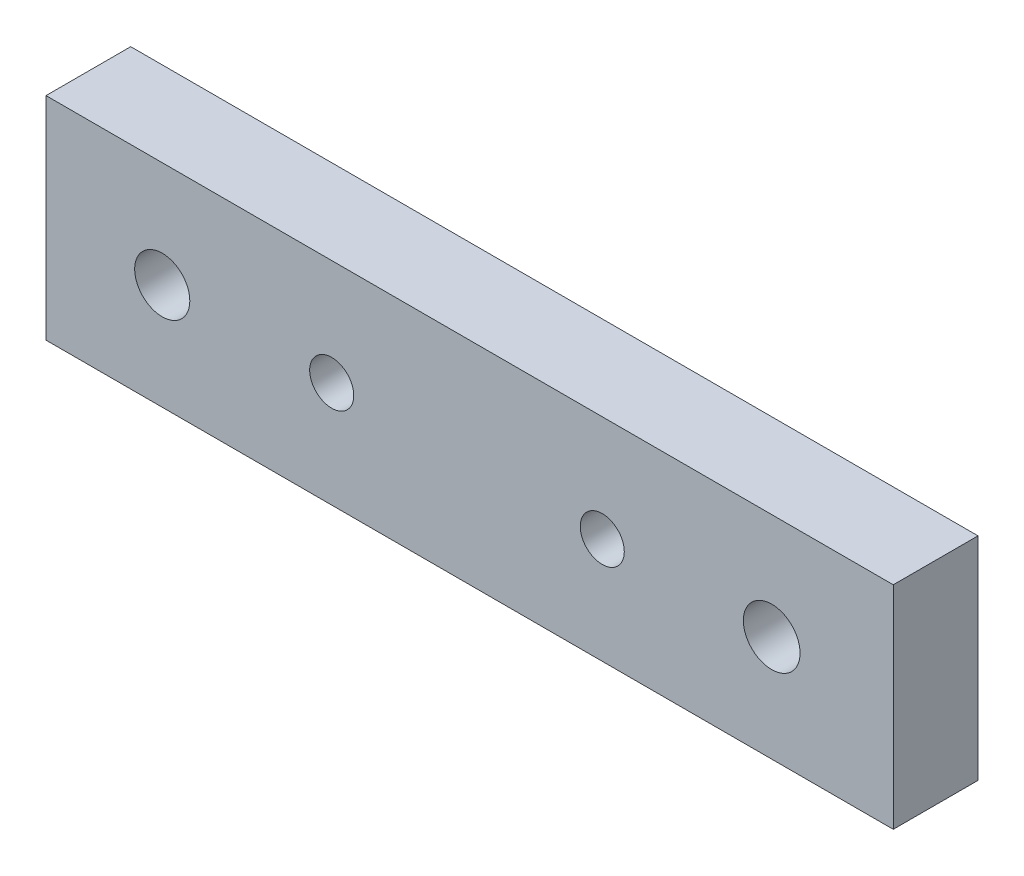
ISO-10303-21;
HEADER;
FILE_DESCRIPTION(('STEP AP214'),'2;1');
FILE_NAME('part.step','',(''),(''),'','','');
FILE_SCHEMA(('AUTOMOTIVE_DESIGN { 1 0 10303 214 1 1 1 1 }'));
ENDSEC;
DATA;
#1=APPLICATION_CONTEXT('core data for automotive mechanical design processes');
#2=APPLICATION_PROTOCOL_DEFINITION('international standard','automotive_design',2000,#1);
#3=PRODUCT_CONTEXT('',#1,'mechanical');
#4=PRODUCT('Part','Part','',(#3));
#5=PRODUCT_RELATED_PRODUCT_CATEGORY('part','',(#4));
#6=PRODUCT_DEFINITION_FORMATION('','',#4);
#7=PRODUCT_DEFINITION_CONTEXT('part definition',#1,'design');
#8=PRODUCT_DEFINITION('design','',#6,#7);
#9=PRODUCT_DEFINITION_SHAPE('','',#8);
#10=(LENGTH_UNIT() NAMED_UNIT(*) SI_UNIT(.MILLI.,.METRE.));
#11=(NAMED_UNIT(*) PLANE_ANGLE_UNIT() SI_UNIT($,.RADIAN.));
#12=(NAMED_UNIT(*) SI_UNIT($,.STERADIAN.) SOLID_ANGLE_UNIT());
#13=UNCERTAINTY_MEASURE_WITH_UNIT(LENGTH_MEASURE(1.E-05),#10,'distance_accuracy_value','');
#14=(GEOMETRIC_REPRESENTATION_CONTEXT(3) GLOBAL_UNCERTAINTY_ASSIGNED_CONTEXT((#13)) GLOBAL_UNIT_ASSIGNED_CONTEXT((#10,
#11,#12)) REPRESENTATION_CONTEXT('',''));
#15=CARTESIAN_POINT('',(0.,0.,0.));
#16=DIRECTION('',(0.,0.,1.));
#17=DIRECTION('',(1.,0.,0.));
#18=AXIS2_PLACEMENT_3D('',#15,#16,#17);
#19=CARTESIAN_POINT('',(-85.3473640143417,12.5,-75.));
#20=DIRECTION('',(0.,0.,1.));
#21=DIRECTION('',(1.,0.,0.));
#22=AXIS2_PLACEMENT_3D('',#19,#20,#21);
#23=CYLINDRICAL_SURFACE('',#22,3.34609875630122);
#24=CARTESIAN_POINT('',(-85.3473640143417,12.5,-17.5));
#25=DIRECTION('',(0.,0.,1.));
#26=DIRECTION('',(1.,0.,0.));
#27=AXIS2_PLACEMENT_3D('',#24,#25,#26);
#28=CIRCLE('',#27,3.34609875630122);
#29=CARTESIAN_POINT('',(-82.0012652580405,12.5,-17.5));
#30=VERTEX_POINT('',#29);
#31=EDGE_CURVE('E444',#30,#30,#28,.T.);
#32=ORIENTED_EDGE('',*,*,#31,.T.);
#33=EDGE_LOOP('',(#32));
#34=FACE_BOUND('',#33,.T.);
#35=CARTESIAN_POINT('',(-85.3473640143417,12.5,-24.5));
#36=DIRECTION('',(0.,0.,-1.));
#37=DIRECTION('',(-1.,0.,0.));
#38=AXIS2_PLACEMENT_3D('',#35,#36,#37);
#39=CIRCLE('',#38,3.34609875630122);
#40=CARTESIAN_POINT('',(-88.6934627706429,12.5,-24.5));
#41=VERTEX_POINT('',#40);
#42=EDGE_CURVE('E36',#41,#41,#39,.F.);
#43=ORIENTED_EDGE('',*,*,#42,.F.);
#44=EDGE_LOOP('',(#43));
#45=FACE_BOUND('',#44,.T.);
#46=ADVANCED_FACE('F32',(#34,#45),#23,.F.);
#47=CARTESIAN_POINT('',(-157.28059455583,12.5,-75.));
#48=DIRECTION('',(0.,0.,1.));
#49=DIRECTION('',(1.,0.,0.));
#50=AXIS2_PLACEMENT_3D('',#47,#48,#49);
#51=CYLINDRICAL_SURFACE('',#50,3.25257439357136);
#52=CARTESIAN_POINT('',(-157.28059455583,12.5,-17.5));
#53=DIRECTION('',(0.,0.,1.));
#54=DIRECTION('',(1.,0.,0.));
#55=AXIS2_PLACEMENT_3D('',#52,#53,#54);
#56=CIRCLE('',#55,3.25257439357136);
#57=CARTESIAN_POINT('',(-154.028020162259,12.5,-17.5));
#58=VERTEX_POINT('',#57);
#59=EDGE_CURVE('E447',#58,#58,#56,.T.);
#60=ORIENTED_EDGE('',*,*,#59,.T.);
#61=EDGE_LOOP('',(#60));
#62=FACE_BOUND('',#61,.T.);
#63=CARTESIAN_POINT('',(-157.28059455583,12.5,-24.5));
#64=DIRECTION('',(0.,0.,-1.));
#65=DIRECTION('',(-1.,0.,0.));
#66=AXIS2_PLACEMENT_3D('',#63,#64,#65);
#67=CIRCLE('',#66,3.25257439357136);
#68=CARTESIAN_POINT('',(-160.533168949402,12.5,-24.5));
#69=VERTEX_POINT('',#68);
#70=EDGE_CURVE('E459',#69,#69,#67,.F.);
#71=ORIENTED_EDGE('',*,*,#70,.F.);
#72=EDGE_LOOP('',(#71));
#73=FACE_BOUND('',#72,.T.);
#74=ADVANCED_FACE('F469',(#62,#73),#51,.F.);
#75=CARTESIAN_POINT('',(-105.347364014342,12.5,-75.));
#76=DIRECTION('',(0.,0.,1.));
#77=DIRECTION('',(1.,0.,0.));
#78=AXIS2_PLACEMENT_3D('',#75,#76,#77);
#79=CYLINDRICAL_SURFACE('',#78,2.6);
#80=CARTESIAN_POINT('',(-105.347364014342,12.5,-17.5));
#81=DIRECTION('',(0.,0.,1.));
#82=DIRECTION('',(1.,0.,0.));
#83=AXIS2_PLACEMENT_3D('',#80,#81,#82);
#84=CIRCLE('',#83,2.6);
#85=CARTESIAN_POINT('',(-102.747364014342,12.5,-17.5));
#86=VERTEX_POINT('',#85);
#87=EDGE_CURVE('E450',#86,#86,#84,.T.);
#88=ORIENTED_EDGE('',*,*,#87,.T.);
#89=EDGE_LOOP('',(#88));
#90=FACE_BOUND('',#89,.T.);
#91=CARTESIAN_POINT('',(-105.347364014342,12.5,-24.5));
#92=DIRECTION('',(0.,0.,-1.));
#93=DIRECTION('',(-1.,0.,0.));
#94=AXIS2_PLACEMENT_3D('',#91,#92,#93);
#95=CIRCLE('',#94,2.6);
#96=CARTESIAN_POINT('',(-107.947364014342,12.5,-24.5));
#97=VERTEX_POINT('',#96);
#98=EDGE_CURVE('E457',#97,#97,#95,.F.);
#99=ORIENTED_EDGE('',*,*,#98,.F.);
#100=EDGE_LOOP('',(#99));
#101=FACE_BOUND('',#100,.T.);
#102=ADVANCED_FACE('F475',(#90,#101),#79,.F.);
#103=CARTESIAN_POINT('',(-137.28059455583,12.5,-75.));
#104=DIRECTION('',(0.,0.,1.));
#105=DIRECTION('',(1.,0.,0.));
#106=AXIS2_PLACEMENT_3D('',#103,#104,#105);
#107=CYLINDRICAL_SURFACE('',#106,2.59999999999999);
#108=CARTESIAN_POINT('',(-137.28059455583,12.5,-17.5));
#109=DIRECTION('',(0.,0.,1.));
#110=DIRECTION('',(1.,0.,0.));
#111=AXIS2_PLACEMENT_3D('',#108,#109,#110);
#112=CIRCLE('',#111,2.59999999999999);
#113=CARTESIAN_POINT('',(-134.68059455583,12.5,-17.5));
#114=VERTEX_POINT('',#113);
#115=EDGE_CURVE('E432',#114,#114,#112,.T.);
#116=ORIENTED_EDGE('',*,*,#115,.T.);
#117=EDGE_LOOP('',(#116));
#118=FACE_BOUND('',#117,.T.);
#119=CARTESIAN_POINT('',(-137.28059455583,12.5,-24.5));
#120=DIRECTION('',(0.,0.,-1.));
#121=DIRECTION('',(-1.,0.,0.));
#122=AXIS2_PLACEMENT_3D('',#119,#120,#121);
#123=CIRCLE('',#122,2.59999999999999);
#124=CARTESIAN_POINT('',(-139.88059455583,12.5,-24.5));
#125=VERTEX_POINT('',#124);
#126=EDGE_CURVE('E268',#125,#125,#123,.F.);
#127=ORIENTED_EDGE('',*,*,#126,.F.);
#128=EDGE_LOOP('',(#127));
#129=FACE_BOUND('',#128,.T.);
#130=ADVANCED_FACE('F501',(#118,#129),#107,.F.);
#131=CARTESIAN_POINT('',(-171.,0.,-27.5));
#132=DIRECTION('',(1.,0.,0.));
#133=DIRECTION('',(0.,0.,-1.));
#134=AXIS2_PLACEMENT_3D('',#131,#132,#133);
#135=PLANE('',#134);
#136=DIRECTION('',(0.,1.,0.));
#137=VECTOR('',#136,1.);
#138=CARTESIAN_POINT('',(-171.,0.,-17.5));
#139=LINE('',#138,#137);
#140=CARTESIAN_POINT('',(-171.,0.,-17.5));
#141=VERTEX_POINT('',#140);
#142=CARTESIAN_POINT('',(-171.,25.,-17.5));
#143=VERTEX_POINT('',#142);
#144=EDGE_CURVE('E428',#141,#143,#139,.T.);
#145=ORIENTED_EDGE('',*,*,#144,.T.);
#146=DIRECTION('',(0.,0.,1.));
#147=VECTOR('',#146,1.);
#148=CARTESIAN_POINT('',(-171.,25.,-27.5));
#149=LINE('',#148,#147);
#150=CARTESIAN_POINT('',(-171.,25.,-27.5));
#151=VERTEX_POINT('',#150);
#152=EDGE_CURVE('E11',#151,#143,#149,.T.);
#153=ORIENTED_EDGE('',*,*,#152,.F.);
#154=DIRECTION('',(0.,1.,0.));
#155=VECTOR('',#154,1.);
#156=CARTESIAN_POINT('',(-171.,0.,-27.5));
#157=LINE('',#156,#155);
#158=CARTESIAN_POINT('',(-171.,0.,-27.5));
#159=VERTEX_POINT('',#158);
#160=EDGE_CURVE('E417',#159,#151,#157,.T.);
#161=ORIENTED_EDGE('',*,*,#160,.F.);
#162=DIRECTION('',(0.,0.,1.));
#163=VECTOR('',#162,1.);
#164=CARTESIAN_POINT('',(-171.,0.,-27.5));
#165=LINE('',#164,#163);
#166=EDGE_CURVE('E427',#159,#141,#165,.T.);
#167=ORIENTED_EDGE('',*,*,#166,.T.);
#168=EDGE_LOOP('',(#145,#153,#161,#167));
#169=FACE_BOUND('',#168,.T.);
#170=ADVANCED_FACE('F34',(#169),#135,.F.);
#171=CARTESIAN_POINT('',(-71.,25.,-27.5));
#172=DIRECTION('',(0.,-1.,0.));
#173=DIRECTION('',(0.,0.,-1.));
#174=AXIS2_PLACEMENT_3D('',#171,#172,#173);
#175=PLANE('',#174);
#176=DIRECTION('',(1.,0.,0.));
#177=VECTOR('',#176,1.);
#178=CARTESIAN_POINT('',(-71.,25.,-17.5));
#179=LINE('',#178,#177);
#180=CARTESIAN_POINT('',(-71.,25.,-17.5));
#181=VERTEX_POINT('',#180);
#182=EDGE_CURVE('E431',#143,#181,#179,.T.);
#183=ORIENTED_EDGE('',*,*,#182,.T.);
#184=DIRECTION('',(0.,0.,1.));
#185=VECTOR('',#184,1.);
#186=CARTESIAN_POINT('',(-71.,25.,-27.5));
#187=LINE('',#186,#185);
#188=CARTESIAN_POINT('',(-71.,25.,-27.5));
#189=VERTEX_POINT('',#188);
#190=EDGE_CURVE('E41',#189,#181,#187,.T.);
#191=ORIENTED_EDGE('',*,*,#190,.F.);
#192=DIRECTION('',(1.,0.,0.));
#193=VECTOR('',#192,1.);
#194=CARTESIAN_POINT('',(-71.,25.,-27.5));
#195=LINE('',#194,#193);
#196=EDGE_CURVE('E420',#151,#189,#195,.T.);
#197=ORIENTED_EDGE('',*,*,#196,.F.);
#198=ORIENTED_EDGE('',*,*,#152,.T.);
#199=EDGE_LOOP('',(#183,#191,#197,#198));
#200=FACE_BOUND('',#199,.T.);
#201=ADVANCED_FACE('F494',(#200),#175,.F.);
#202=CARTESIAN_POINT('',(-71.,0.,-27.5));
#203=DIRECTION('',(-1.,0.,0.));
#204=DIRECTION('',(0.,0.,1.));
#205=AXIS2_PLACEMENT_3D('',#202,#203,#204);
#206=PLANE('',#205);
#207=DIRECTION('',(0.,-1.,0.));
#208=VECTOR('',#207,1.);
#209=CARTESIAN_POINT('',(-71.,0.,-17.5));
#210=LINE('',#209,#208);
#211=CARTESIAN_POINT('',(-71.,0.,-17.5));
#212=VERTEX_POINT('',#211);
#213=EDGE_CURVE('E434',#181,#212,#210,.T.);
#214=ORIENTED_EDGE('',*,*,#213,.T.);
#215=DIRECTION('',(0.,0.,1.));
#216=VECTOR('',#215,1.);
#217=CARTESIAN_POINT('',(-71.,0.,-27.5));
#218=LINE('',#217,#216);
#219=CARTESIAN_POINT('',(-71.,0.,-27.5));
#220=VERTEX_POINT('',#219);
#221=EDGE_CURVE('E439',#220,#212,#218,.T.);
#222=ORIENTED_EDGE('',*,*,#221,.F.);
#223=DIRECTION('',(0.,-1.,0.));
#224=VECTOR('',#223,1.);
#225=CARTESIAN_POINT('',(-71.,0.,-27.5));
#226=LINE('',#225,#224);
#227=EDGE_CURVE('E423',#189,#220,#226,.T.);
#228=ORIENTED_EDGE('',*,*,#227,.F.);
#229=ORIENTED_EDGE('',*,*,#190,.T.);
#230=EDGE_LOOP('',(#214,#222,#228,#229));
#231=FACE_BOUND('',#230,.T.);
#232=ADVANCED_FACE('F491',(#231),#206,.F.);
#233=CARTESIAN_POINT('',(-71.,0.,-27.5));
#234=DIRECTION('',(0.,1.,0.));
#235=DIRECTION('',(-1.,0.,0.));
#236=AXIS2_PLACEMENT_3D('',#233,#234,#235);
#237=PLANE('',#236);
#238=DIRECTION('',(-1.,0.,0.));
#239=VECTOR('',#238,1.);
#240=CARTESIAN_POINT('',(-71.,0.,-17.5));
#241=LINE('',#240,#239);
#242=EDGE_CURVE('E421',#212,#141,#241,.T.);
#243=ORIENTED_EDGE('',*,*,#242,.T.);
#244=ORIENTED_EDGE('',*,*,#166,.F.);
#245=DIRECTION('',(-1.,0.,0.));
#246=VECTOR('',#245,1.);
#247=CARTESIAN_POINT('',(-71.,0.,-27.5));
#248=LINE('',#247,#246);
#249=EDGE_CURVE('E425',#220,#159,#248,.T.);
#250=ORIENTED_EDGE('',*,*,#249,.F.);
#251=ORIENTED_EDGE('',*,*,#221,.T.);
#252=EDGE_LOOP('',(#243,#244,#250,#251));
#253=FACE_BOUND('',#252,.T.);
#254=ADVANCED_FACE('F484',(#253),#237,.F.);
#255=CARTESIAN_POINT('',(0.,0.,-27.5));
#256=DIRECTION('',(0.,0.,1.));
#257=DIRECTION('',(1.,0.,0.));
#258=AXIS2_PLACEMENT_3D('',#255,#256,#257);
#259=PLANE('',#258);
#260=DIRECTION('',(-0.499999999999999,0.866025403784439,0.));
#261=VECTOR('',#260,1.);
#262=CARTESIAN_POINT('',(-139.647730659508,8.4,-27.5));
#263=LINE('',#262,#261);
#264=CARTESIAN_POINT('',(-139.647730659508,8.39999999999999,-27.5));
#265=VERTEX_POINT('',#264);
#266=CARTESIAN_POINT('',(-142.014866763185,12.5,-27.5));
#267=VERTEX_POINT('',#266);
#268=EDGE_CURVE('E255',#265,#267,#263,.T.);
#269=ORIENTED_EDGE('',*,*,#268,.F.);
#270=DIRECTION('',(-1.,0.,0.));
#271=VECTOR('',#270,1.);
#272=CARTESIAN_POINT('',(-134.913458452153,8.4,-27.5));
#273=LINE('',#272,#271);
#274=CARTESIAN_POINT('',(-134.913458452153,8.4,-27.5));
#275=VERTEX_POINT('',#274);
#276=EDGE_CURVE('E49',#275,#265,#273,.T.);
#277=ORIENTED_EDGE('',*,*,#276,.F.);
#278=DIRECTION('',(-0.5,-0.866025403784438,0.));
#279=VECTOR('',#278,1.);
#280=CARTESIAN_POINT('',(-132.546322348475,12.5,-27.5));
#281=LINE('',#280,#279);
#282=CARTESIAN_POINT('',(-132.546322348475,12.5,-27.5));
#283=VERTEX_POINT('',#282);
#284=EDGE_CURVE('E241',#283,#275,#281,.T.);
#285=ORIENTED_EDGE('',*,*,#284,.F.);
#286=DIRECTION('',(0.499999999999994,-0.866025403784442,0.));
#287=VECTOR('',#286,1.);
#288=CARTESIAN_POINT('',(-134.913458452153,16.6,-27.5));
#289=LINE('',#288,#287);
#290=CARTESIAN_POINT('',(-134.913458452153,16.6,-27.5));
#291=VERTEX_POINT('',#290);
#292=EDGE_CURVE('E244',#291,#283,#289,.T.);
#293=ORIENTED_EDGE('',*,*,#292,.F.);
#294=DIRECTION('',(1.,0.,0.));
#295=VECTOR('',#294,1.);
#296=CARTESIAN_POINT('',(-139.647730659508,16.6,-27.5));
#297=LINE('',#296,#295);
#298=CARTESIAN_POINT('',(-139.647730659508,16.6,-27.5));
#299=VERTEX_POINT('',#298);
#300=EDGE_CURVE('E261',#299,#291,#297,.T.);
#301=ORIENTED_EDGE('',*,*,#300,.F.);
#302=DIRECTION('',(0.5,0.866025403784439,0.));
#303=VECTOR('',#302,1.);
#304=CARTESIAN_POINT('',(-142.014866763185,12.5,-27.5));
#305=LINE('',#304,#303);
#306=EDGE_CURVE('E258',#267,#299,#305,.T.);
#307=ORIENTED_EDGE('',*,*,#306,.F.);
#308=EDGE_LOOP('',(#269,#277,#285,#293,#301,#307));
#309=FACE_BOUND('',#308,.T.);
#310=DIRECTION('',(-0.499999999999999,0.866025403784439,0.));
#311=VECTOR('',#310,1.);
#312=CARTESIAN_POINT('',(-107.714500118019,8.40000000000002,-27.5));
#313=LINE('',#312,#311);
#314=CARTESIAN_POINT('',(-107.714500118019,8.40000000000003,-27.5));
#315=VERTEX_POINT('',#314);
#316=CARTESIAN_POINT('',(-110.081636221697,12.5,-27.5));
#317=VERTEX_POINT('',#316);
#318=EDGE_CURVE('E297',#315,#317,#313,.T.);
#319=ORIENTED_EDGE('',*,*,#318,.F.);
#320=DIRECTION('',(-1.,0.,0.));
#321=VECTOR('',#320,1.);
#322=CARTESIAN_POINT('',(-102.980227910664,8.40000000000002,-27.5));
#323=LINE('',#322,#321);
#324=CARTESIAN_POINT('',(-102.980227910664,8.40000000000002,-27.5));
#325=VERTEX_POINT('',#324);
#326=EDGE_CURVE('E57',#325,#315,#323,.T.);
#327=ORIENTED_EDGE('',*,*,#326,.F.);
#328=DIRECTION('',(-0.499999999999999,-0.866025403784439,0.));
#329=VECTOR('',#328,1.);
#330=CARTESIAN_POINT('',(-100.613091806987,12.5,-27.5));
#331=LINE('',#330,#329);
#332=CARTESIAN_POINT('',(-100.613091806987,12.5,-27.5));
#333=VERTEX_POINT('',#332);
#334=EDGE_CURVE('E280',#333,#325,#331,.T.);
#335=ORIENTED_EDGE('',*,*,#334,.F.);
#336=DIRECTION('',(0.5,-0.866025403784439,0.));
#337=VECTOR('',#336,1.);
#338=CARTESIAN_POINT('',(-102.980227910664,16.6,-27.5));
#339=LINE('',#338,#337);
#340=CARTESIAN_POINT('',(-102.980227910664,16.6,-27.5));
#341=VERTEX_POINT('',#340);
#342=EDGE_CURVE('E307',#341,#333,#339,.T.);
#343=ORIENTED_EDGE('',*,*,#342,.F.);
#344=DIRECTION('',(1.,0.,0.));
#345=VECTOR('',#344,1.);
#346=CARTESIAN_POINT('',(-107.714500118019,16.6,-27.5));
#347=LINE('',#346,#345);
#348=CARTESIAN_POINT('',(-107.714500118019,16.6,-27.5));
#349=VERTEX_POINT('',#348);
#350=EDGE_CURVE('E304',#349,#341,#347,.T.);
#351=ORIENTED_EDGE('',*,*,#350,.F.);
#352=DIRECTION('',(0.499999999999998,0.86602540378444,0.));
#353=VECTOR('',#352,1.);
#354=CARTESIAN_POINT('',(-110.081636221697,12.5,-27.5));
#355=LINE('',#354,#353);
#356=EDGE_CURVE('E301',#317,#349,#355,.T.);
#357=ORIENTED_EDGE('',*,*,#356,.F.);
#358=EDGE_LOOP('',(#319,#327,#335,#343,#351,#357));
#359=FACE_BOUND('',#358,.T.);
#360=DIRECTION('',(-0.5,0.866025403784439,0.));
#361=VECTOR('',#360,1.);
#362=CARTESIAN_POINT('',(-159.759099757909,8.20710306317599,-27.5));
#363=LINE('',#362,#361);
#364=CARTESIAN_POINT('',(-159.759099757909,8.20710306317597,-27.5));
#365=VERTEX_POINT('',#364);
#366=CARTESIAN_POINT('',(-162.237604959988,12.5,-27.5));
#367=VERTEX_POINT('',#366);
#368=EDGE_CURVE('E344',#365,#367,#363,.T.);
#369=ORIENTED_EDGE('',*,*,#368,.F.);
#370=DIRECTION('',(-1.,0.,0.));
#371=VECTOR('',#370,1.);
#372=CARTESIAN_POINT('',(-154.802089353752,8.20710306317599,-27.5));
#373=LINE('',#372,#371);
#374=CARTESIAN_POINT('',(-154.802089353752,8.20710306317599,-27.5));
#375=VERTEX_POINT('',#374);
#376=EDGE_CURVE('E342',#375,#365,#373,.T.);
#377=ORIENTED_EDGE('',*,*,#376,.F.);
#378=DIRECTION('',(-0.499999999999997,-0.86602540378444,0.));
#379=VECTOR('',#378,1.);
#380=CARTESIAN_POINT('',(-152.323584151673,12.5,-27.5));
#381=LINE('',#380,#379);
#382=CARTESIAN_POINT('',(-152.323584151673,12.5,-27.5));
#383=VERTEX_POINT('',#382);
#384=EDGE_CURVE('E326',#383,#375,#381,.T.);
#385=ORIENTED_EDGE('',*,*,#384,.F.);
#386=DIRECTION('',(0.5,-0.866025403784439,0.));
#387=VECTOR('',#386,1.);
#388=CARTESIAN_POINT('',(-154.802089353752,16.792896936824,-27.5));
#389=LINE('',#388,#387);
#390=CARTESIAN_POINT('',(-154.802089353752,16.792896936824,-27.5));
#391=VERTEX_POINT('',#390);
#392=EDGE_CURVE('E354',#391,#383,#389,.T.);
#393=ORIENTED_EDGE('',*,*,#392,.F.);
#394=DIRECTION('',(1.,0.,0.));
#395=VECTOR('',#394,1.);
#396=CARTESIAN_POINT('',(-159.759099757909,16.792896936824,-27.5));
#397=LINE('',#396,#395);
#398=CARTESIAN_POINT('',(-159.759099757909,16.792896936824,-27.5));
#399=VERTEX_POINT('',#398);
#400=EDGE_CURVE('E351',#399,#391,#397,.T.);
#401=ORIENTED_EDGE('',*,*,#400,.F.);
#402=DIRECTION('',(0.500000000000001,0.866025403784438,0.));
#403=VECTOR('',#402,1.);
#404=CARTESIAN_POINT('',(-162.237604959988,12.5,-27.5));
#405=LINE('',#404,#403);
#406=EDGE_CURVE('E348',#367,#399,#405,.T.);
#407=ORIENTED_EDGE('',*,*,#406,.F.);
#408=EDGE_LOOP('',(#369,#377,#385,#393,#401,#407));
#409=FACE_BOUND('',#408,.T.);
#410=DIRECTION('',(-0.500000000000003,0.866025403784437,0.));
#411=VECTOR('',#410,1.);
#412=CARTESIAN_POINT('',(-87.7145001180192,8.39999999999996,-27.5));
#413=LINE('',#412,#411);
#414=CARTESIAN_POINT('',(-87.7145001180192,8.39999999999996,-27.5));
#415=VERTEX_POINT('',#414);
#416=CARTESIAN_POINT('',(-90.0816362216967,12.5,-27.5));
#417=VERTEX_POINT('',#416);
#418=EDGE_CURVE('E392',#415,#417,#413,.T.);
#419=ORIENTED_EDGE('',*,*,#418,.F.);
#420=DIRECTION('',(-1.,0.,0.));
#421=VECTOR('',#420,1.);
#422=CARTESIAN_POINT('',(-82.9802279106642,8.39999999999996,-27.5));
#423=LINE('',#422,#421);
#424=CARTESIAN_POINT('',(-82.9802279106642,8.39999999999996,-27.5));
#425=VERTEX_POINT('',#424);
#426=EDGE_CURVE('E390',#425,#415,#423,.T.);
#427=ORIENTED_EDGE('',*,*,#426,.F.);
#428=DIRECTION('',(-0.499999999999999,-0.866025403784439,0.));
#429=VECTOR('',#428,1.);
#430=CARTESIAN_POINT('',(-80.6130918069868,12.5,-27.5));
#431=LINE('',#430,#429);
#432=CARTESIAN_POINT('',(-80.6130918069868,12.5,-27.5));
#433=VERTEX_POINT('',#432);
#434=EDGE_CURVE('E374',#433,#425,#431,.T.);
#435=ORIENTED_EDGE('',*,*,#434,.F.);
#436=DIRECTION('',(0.5,-0.866025403784439,0.));
#437=VECTOR('',#436,1.);
#438=CARTESIAN_POINT('',(-82.9802279106642,16.6,-27.5));
#439=LINE('',#438,#437);
#440=CARTESIAN_POINT('',(-82.9802279106642,16.6,-27.5));
#441=VERTEX_POINT('',#440);
#442=EDGE_CURVE('E401',#441,#433,#439,.T.);
#443=ORIENTED_EDGE('',*,*,#442,.F.);
#444=DIRECTION('',(1.,0.,0.));
#445=VECTOR('',#444,1.);
#446=CARTESIAN_POINT('',(-87.7145001180192,16.6,-27.5));
#447=LINE('',#446,#445);
#448=CARTESIAN_POINT('',(-87.7145001180192,16.6,-27.5));
#449=VERTEX_POINT('',#448);
#450=EDGE_CURVE('E398',#449,#441,#447,.T.);
#451=ORIENTED_EDGE('',*,*,#450,.F.);
#452=DIRECTION('',(0.500000000000001,0.866025403784438,0.));
#453=VECTOR('',#452,1.);
#454=CARTESIAN_POINT('',(-90.0816362216967,12.5,-27.5));
#455=LINE('',#454,#453);
#456=EDGE_CURVE('E395',#417,#449,#455,.T.);
#457=ORIENTED_EDGE('',*,*,#456,.F.);
#458=EDGE_LOOP('',(#419,#427,#435,#443,#451,#457));
#459=FACE_BOUND('',#458,.T.);
#460=ORIENTED_EDGE('',*,*,#160,.T.);
#461=ORIENTED_EDGE('',*,*,#196,.T.);
#462=ORIENTED_EDGE('',*,*,#227,.T.);
#463=ORIENTED_EDGE('',*,*,#249,.T.);
#464=EDGE_LOOP('',(#460,#461,#462,#463));
#465=FACE_BOUND('',#464,.T.);
#466=ADVANCED_FACE('F480',(#309,#359,#409,#459,#465),#259,.F.);
#467=CARTESIAN_POINT('',(0.,0.,-17.5));
#468=DIRECTION('',(0.,0.,1.));
#469=DIRECTION('',(1.,0.,0.));
#470=AXIS2_PLACEMENT_3D('',#467,#468,#469);
#471=PLANE('',#470);
#472=ORIENTED_EDGE('',*,*,#115,.F.);
#473=EDGE_LOOP('',(#472));
#474=FACE_BOUND('',#473,.T.);
#475=ORIENTED_EDGE('',*,*,#87,.F.);
#476=EDGE_LOOP('',(#475));
#477=FACE_BOUND('',#476,.T.);
#478=ORIENTED_EDGE('',*,*,#59,.F.);
#479=EDGE_LOOP('',(#478));
#480=FACE_BOUND('',#479,.T.);
#481=ORIENTED_EDGE('',*,*,#31,.F.);
#482=EDGE_LOOP('',(#481));
#483=FACE_BOUND('',#482,.T.);
#484=ORIENTED_EDGE('',*,*,#144,.F.);
#485=ORIENTED_EDGE('',*,*,#242,.F.);
#486=ORIENTED_EDGE('',*,*,#213,.F.);
#487=ORIENTED_EDGE('',*,*,#182,.F.);
#488=EDGE_LOOP('',(#484,#485,#486,#487));
#489=FACE_BOUND('',#488,.T.);
#490=ADVANCED_FACE('F483',(#474,#477,#480,#483,#489),#471,.T.);
#491=CARTESIAN_POINT('',(0.,0.,-24.5000000000001));
#492=DIRECTION('',(0.,0.,-1.));
#493=DIRECTION('',(-1.,0.,0.));
#494=AXIS2_PLACEMENT_3D('',#491,#492,#493);
#495=PLANE('',#494);
#496=DIRECTION('',(-1.,0.,0.));
#497=VECTOR('',#496,1.);
#498=CARTESIAN_POINT('',(-134.913458452153,8.4,-24.5));
#499=LINE('',#498,#497);
#500=CARTESIAN_POINT('',(-134.913458452153,8.4,-24.5));
#501=VERTEX_POINT('',#500);
#502=CARTESIAN_POINT('',(-139.647730659508,8.4,-24.5));
#503=VERTEX_POINT('',#502);
#504=EDGE_CURVE('E221',#501,#503,#499,.T.);
#505=ORIENTED_EDGE('',*,*,#504,.T.);
#506=DIRECTION('',(-0.499999999999999,0.866025403784439,0.));
#507=VECTOR('',#506,1.);
#508=CARTESIAN_POINT('',(-139.647730659508,8.4,-24.5));
#509=LINE('',#508,#507);
#510=CARTESIAN_POINT('',(-142.014866763185,12.5,-24.5));
#511=VERTEX_POINT('',#510);
#512=EDGE_CURVE('E230',#503,#511,#509,.T.);
#513=ORIENTED_EDGE('',*,*,#512,.T.);
#514=DIRECTION('',(0.5,0.866025403784439,0.));
#515=VECTOR('',#514,1.);
#516=CARTESIAN_POINT('',(-142.014866763185,12.5,-24.5));
#517=LINE('',#516,#515);
#518=CARTESIAN_POINT('',(-139.647730659508,16.6,-24.5));
#519=VERTEX_POINT('',#518);
#520=EDGE_CURVE('E235',#511,#519,#517,.T.);
#521=ORIENTED_EDGE('',*,*,#520,.T.);
#522=DIRECTION('',(1.,0.,0.));
#523=VECTOR('',#522,1.);
#524=CARTESIAN_POINT('',(-139.647730659508,16.6,-24.5));
#525=LINE('',#524,#523);
#526=CARTESIAN_POINT('',(-134.913458452153,16.6,-24.5));
#527=VERTEX_POINT('',#526);
#528=EDGE_CURVE('E248',#519,#527,#525,.T.);
#529=ORIENTED_EDGE('',*,*,#528,.T.);
#530=DIRECTION('',(0.499999999999994,-0.866025403784442,0.));
#531=VECTOR('',#530,1.);
#532=CARTESIAN_POINT('',(-134.913458452153,16.6,-24.5));
#533=LINE('',#532,#531);
#534=CARTESIAN_POINT('',(-132.546322348475,12.5,-24.5));
#535=VERTEX_POINT('',#534);
#536=EDGE_CURVE('E251',#527,#535,#533,.T.);
#537=ORIENTED_EDGE('',*,*,#536,.T.);
#538=DIRECTION('',(-0.5,-0.866025403784438,0.));
#539=VECTOR('',#538,1.);
#540=CARTESIAN_POINT('',(-132.546322348475,12.5,-24.5));
#541=LINE('',#540,#539);
#542=EDGE_CURVE('E227',#535,#501,#541,.T.);
#543=ORIENTED_EDGE('',*,*,#542,.T.);
#544=EDGE_LOOP('',(#505,#513,#521,#529,#537,#543));
#545=FACE_BOUND('',#544,.T.);
#546=ORIENTED_EDGE('',*,*,#126,.T.);
#547=EDGE_LOOP('',(#546));
#548=FACE_BOUND('',#547,.T.);
#549=ADVANCED_FACE('F237',(#545,#548),#495,.T.);
#550=CARTESIAN_POINT('',(-134.913458452153,8.4,-24.5));
#551=DIRECTION('',(0.,-1.,0.));
#552=DIRECTION('',(1.,0.,0.));
#553=AXIS2_PLACEMENT_3D('',#550,#551,#552);
#554=PLANE('',#553);
#555=ORIENTED_EDGE('',*,*,#276,.T.);
#556=DIRECTION('',(0.,0.,-1.));
#557=VECTOR('',#556,1.);
#558=CARTESIAN_POINT('',(-139.647730659508,8.4,-24.5));
#559=LINE('',#558,#557);
#560=EDGE_CURVE('E217',#503,#265,#559,.T.);
#561=ORIENTED_EDGE('',*,*,#560,.F.);
#562=ORIENTED_EDGE('',*,*,#504,.F.);
#563=DIRECTION('',(0.,0.,-1.));
#564=VECTOR('',#563,1.);
#565=CARTESIAN_POINT('',(-134.913458452153,8.4,-24.5));
#566=LINE('',#565,#564);
#567=EDGE_CURVE('E266',#501,#275,#566,.T.);
#568=ORIENTED_EDGE('',*,*,#567,.T.);
#569=EDGE_LOOP('',(#555,#561,#562,#568));
#570=FACE_BOUND('',#569,.T.);
#571=ADVANCED_FACE('F219',(#570),#554,.F.);
#572=CARTESIAN_POINT('',(-132.546322348475,12.5,-24.5));
#573=DIRECTION('',(0.866025403784438,-0.5,0.));
#574=DIRECTION('',(0.5,0.866025403784439,0.));
#575=AXIS2_PLACEMENT_3D('',#572,#573,#574);
#576=PLANE('',#575);
#577=ORIENTED_EDGE('',*,*,#284,.T.);
#578=ORIENTED_EDGE('',*,*,#567,.F.);
#579=ORIENTED_EDGE('',*,*,#542,.F.);
#580=DIRECTION('',(0.,0.,-1.));
#581=VECTOR('',#580,1.);
#582=CARTESIAN_POINT('',(-132.546322348475,12.5,-24.5));
#583=LINE('',#582,#581);
#584=EDGE_CURVE('E269',#535,#283,#583,.T.);
#585=ORIENTED_EDGE('',*,*,#584,.T.);
#586=EDGE_LOOP('',(#577,#578,#579,#585));
#587=FACE_BOUND('',#586,.T.);
#588=ADVANCED_FACE('F610',(#587),#576,.F.);
#589=CARTESIAN_POINT('',(-134.913458452153,16.6,-24.5));
#590=DIRECTION('',(0.866025403784442,0.499999999999994,0.));
#591=DIRECTION('',(-0.499999999999994,0.866025403784442,0.));
#592=AXIS2_PLACEMENT_3D('',#589,#590,#591);
#593=PLANE('',#592);
#594=ORIENTED_EDGE('',*,*,#292,.T.);
#595=ORIENTED_EDGE('',*,*,#584,.F.);
#596=ORIENTED_EDGE('',*,*,#536,.F.);
#597=DIRECTION('',(0.,0.,-1.));
#598=VECTOR('',#597,1.);
#599=CARTESIAN_POINT('',(-134.913458452153,16.6,-24.5));
#600=LINE('',#599,#598);
#601=EDGE_CURVE('E271',#527,#291,#600,.T.);
#602=ORIENTED_EDGE('',*,*,#601,.T.);
#603=EDGE_LOOP('',(#594,#595,#596,#602));
#604=FACE_BOUND('',#603,.T.);
#605=ADVANCED_FACE('F620',(#604),#593,.F.);
#606=CARTESIAN_POINT('',(-139.647730659508,16.6,-24.5));
#607=DIRECTION('',(0.,1.,0.));
#608=DIRECTION('',(0.,0.,1.));
#609=AXIS2_PLACEMENT_3D('',#606,#607,#608);
#610=PLANE('',#609);
#611=ORIENTED_EDGE('',*,*,#300,.T.);
#612=ORIENTED_EDGE('',*,*,#601,.F.);
#613=ORIENTED_EDGE('',*,*,#528,.F.);
#614=DIRECTION('',(0.,0.,-1.));
#615=VECTOR('',#614,1.);
#616=CARTESIAN_POINT('',(-139.647730659508,16.6,-24.5));
#617=LINE('',#616,#615);
#618=EDGE_CURVE('E273',#519,#299,#617,.T.);
#619=ORIENTED_EDGE('',*,*,#618,.T.);
#620=EDGE_LOOP('',(#611,#612,#613,#619));
#621=FACE_BOUND('',#620,.T.);
#622=ADVANCED_FACE('F616',(#621),#610,.F.);
#623=CARTESIAN_POINT('',(-142.014866763185,12.5,-24.5));
#624=DIRECTION('',(-0.866025403784439,0.5,0.));
#625=DIRECTION('',(-0.5,-0.866025403784439,0.));
#626=AXIS2_PLACEMENT_3D('',#623,#624,#625);
#627=PLANE('',#626);
#628=ORIENTED_EDGE('',*,*,#306,.T.);
#629=ORIENTED_EDGE('',*,*,#618,.F.);
#630=ORIENTED_EDGE('',*,*,#520,.F.);
#631=DIRECTION('',(0.,0.,-1.));
#632=VECTOR('',#631,1.);
#633=CARTESIAN_POINT('',(-142.014866763185,12.5,-24.5));
#634=LINE('',#633,#632);
#635=EDGE_CURVE('E226',#511,#267,#634,.T.);
#636=ORIENTED_EDGE('',*,*,#635,.T.);
#637=EDGE_LOOP('',(#628,#629,#630,#636));
#638=FACE_BOUND('',#637,.T.);
#639=ADVANCED_FACE('F613',(#638),#627,.F.);
#640=CARTESIAN_POINT('',(-139.647730659508,8.4,-24.5));
#641=DIRECTION('',(-0.866025403784439,-0.499999999999999,0.));
#642=DIRECTION('',(0.499999999999999,-0.866025403784439,0.));
#643=AXIS2_PLACEMENT_3D('',#640,#641,#642);
#644=PLANE('',#643);
#645=ORIENTED_EDGE('',*,*,#268,.T.);
#646=ORIENTED_EDGE('',*,*,#635,.F.);
#647=ORIENTED_EDGE('',*,*,#512,.F.);
#648=ORIENTED_EDGE('',*,*,#560,.T.);
#649=EDGE_LOOP('',(#645,#646,#647,#648));
#650=FACE_BOUND('',#649,.T.);
#651=ADVANCED_FACE('F231',(#650),#644,.F.);
#652=CARTESIAN_POINT('',(0.,0.,-24.5000000000001));
#653=DIRECTION('',(0.,0.,-1.));
#654=DIRECTION('',(-1.,0.,0.));
#655=AXIS2_PLACEMENT_3D('',#652,#653,#654);
#656=PLANE('',#655);
#657=DIRECTION('',(-1.,0.,0.));
#658=VECTOR('',#657,1.);
#659=CARTESIAN_POINT('',(-102.980227910664,8.40000000000002,-24.5));
#660=LINE('',#659,#658);
#661=CARTESIAN_POINT('',(-102.980227910664,8.40000000000002,-24.5));
#662=VERTEX_POINT('',#661);
#663=CARTESIAN_POINT('',(-107.714500118019,8.40000000000002,-24.5));
#664=VERTEX_POINT('',#663);
#665=EDGE_CURVE('E276',#662,#664,#660,.T.);
#666=ORIENTED_EDGE('',*,*,#665,.T.);
#667=DIRECTION('',(-0.499999999999999,0.866025403784439,0.));
#668=VECTOR('',#667,1.);
#669=CARTESIAN_POINT('',(-107.714500118019,8.40000000000002,-24.5));
#670=LINE('',#669,#668);
#671=CARTESIAN_POINT('',(-110.081636221697,12.5,-24.5));
#672=VERTEX_POINT('',#671);
#673=EDGE_CURVE('E279',#664,#672,#670,.T.);
#674=ORIENTED_EDGE('',*,*,#673,.T.);
#675=DIRECTION('',(0.499999999999998,0.86602540378444,0.));
#676=VECTOR('',#675,1.);
#677=CARTESIAN_POINT('',(-110.081636221697,12.5,-24.5));
#678=LINE('',#677,#676);
#679=CARTESIAN_POINT('',(-107.714500118019,16.6,-24.5));
#680=VERTEX_POINT('',#679);
#681=EDGE_CURVE('E283',#672,#680,#678,.T.);
#682=ORIENTED_EDGE('',*,*,#681,.T.);
#683=DIRECTION('',(1.,0.,0.));
#684=VECTOR('',#683,1.);
#685=CARTESIAN_POINT('',(-107.714500118019,16.6,-24.5));
#686=LINE('',#685,#684);
#687=CARTESIAN_POINT('',(-102.980227910664,16.6,-24.5));
#688=VERTEX_POINT('',#687);
#689=EDGE_CURVE('E286',#680,#688,#686,.T.);
#690=ORIENTED_EDGE('',*,*,#689,.T.);
#691=DIRECTION('',(0.5,-0.866025403784439,0.));
#692=VECTOR('',#691,1.);
#693=CARTESIAN_POINT('',(-102.980227910664,16.6,-24.5));
#694=LINE('',#693,#692);
#695=CARTESIAN_POINT('',(-100.613091806987,12.5,-24.5));
#696=VERTEX_POINT('',#695);
#697=EDGE_CURVE('E289',#688,#696,#694,.T.);
#698=ORIENTED_EDGE('',*,*,#697,.T.);
#699=DIRECTION('',(-0.499999999999999,-0.866025403784439,0.));
#700=VECTOR('',#699,1.);
#701=CARTESIAN_POINT('',(-100.613091806987,12.5,-24.5));
#702=LINE('',#701,#700);
#703=EDGE_CURVE('E292',#696,#662,#702,.T.);
#704=ORIENTED_EDGE('',*,*,#703,.T.);
#705=EDGE_LOOP('',(#666,#674,#682,#690,#698,#704));
#706=FACE_BOUND('',#705,.T.);
#707=ORIENTED_EDGE('',*,*,#98,.T.);
#708=EDGE_LOOP('',(#707));
#709=FACE_BOUND('',#708,.T.);
#710=ADVANCED_FACE('F586',(#706,#709),#656,.T.);
#711=CARTESIAN_POINT('',(-102.980227910664,8.40000000000002,-24.5));
#712=DIRECTION('',(0.,-1.,0.));
#713=DIRECTION('',(0.,0.,-1.));
#714=AXIS2_PLACEMENT_3D('',#711,#712,#713);
#715=PLANE('',#714);
#716=ORIENTED_EDGE('',*,*,#326,.T.);
#717=DIRECTION('',(0.,0.,-1.));
#718=VECTOR('',#717,1.);
#719=CARTESIAN_POINT('',(-107.714500118019,8.40000000000002,-24.5));
#720=LINE('',#719,#718);
#721=EDGE_CURVE('E295',#664,#315,#720,.T.);
#722=ORIENTED_EDGE('',*,*,#721,.F.);
#723=ORIENTED_EDGE('',*,*,#665,.F.);
#724=DIRECTION('',(0.,0.,-1.));
#725=VECTOR('',#724,1.);
#726=CARTESIAN_POINT('',(-102.980227910664,8.40000000000002,-24.5));
#727=LINE('',#726,#725);
#728=EDGE_CURVE('E256',#662,#325,#727,.T.);
#729=ORIENTED_EDGE('',*,*,#728,.T.);
#730=EDGE_LOOP('',(#716,#722,#723,#729));
#731=FACE_BOUND('',#730,.T.);
#732=ADVANCED_FACE('F582',(#731),#715,.F.);
#733=CARTESIAN_POINT('',(-100.613091806987,12.5,-24.5));
#734=DIRECTION('',(0.866025403784439,-0.499999999999999,0.));
#735=DIRECTION('',(0.499999999999999,0.866025403784439,0.));
#736=AXIS2_PLACEMENT_3D('',#733,#734,#735);
#737=PLANE('',#736);
#738=ORIENTED_EDGE('',*,*,#334,.T.);
#739=ORIENTED_EDGE('',*,*,#728,.F.);
#740=ORIENTED_EDGE('',*,*,#703,.F.);
#741=DIRECTION('',(0.,0.,-1.));
#742=VECTOR('',#741,1.);
#743=CARTESIAN_POINT('',(-100.613091806987,12.5,-24.5));
#744=LINE('',#743,#742);
#745=EDGE_CURVE('E313',#696,#333,#744,.T.);
#746=ORIENTED_EDGE('',*,*,#745,.T.);
#747=EDGE_LOOP('',(#738,#739,#740,#746));
#748=FACE_BOUND('',#747,.T.);
#749=ADVANCED_FACE('F585',(#748),#737,.F.);
#750=CARTESIAN_POINT('',(-102.980227910664,16.6,-24.5));
#751=DIRECTION('',(0.866025403784438,0.5,0.));
#752=DIRECTION('',(-0.5,0.866025403784439,0.));
#753=AXIS2_PLACEMENT_3D('',#750,#751,#752);
#754=PLANE('',#753);
#755=ORIENTED_EDGE('',*,*,#342,.T.);
#756=ORIENTED_EDGE('',*,*,#745,.F.);
#757=ORIENTED_EDGE('',*,*,#697,.F.);
#758=DIRECTION('',(0.,0.,-1.));
#759=VECTOR('',#758,1.);
#760=CARTESIAN_POINT('',(-102.980227910664,16.6,-24.5));
#761=LINE('',#760,#759);
#762=EDGE_CURVE('E315',#688,#341,#761,.T.);
#763=ORIENTED_EDGE('',*,*,#762,.T.);
#764=EDGE_LOOP('',(#755,#756,#757,#763));
#765=FACE_BOUND('',#764,.T.);
#766=ADVANCED_FACE('F597',(#765),#754,.F.);
#767=CARTESIAN_POINT('',(-107.714500118019,16.6,-24.5));
#768=DIRECTION('',(0.,1.,0.));
#769=DIRECTION('',(0.,0.,1.));
#770=AXIS2_PLACEMENT_3D('',#767,#768,#769);
#771=PLANE('',#770);
#772=ORIENTED_EDGE('',*,*,#350,.T.);
#773=ORIENTED_EDGE('',*,*,#762,.F.);
#774=ORIENTED_EDGE('',*,*,#689,.F.);
#775=DIRECTION('',(0.,0.,-1.));
#776=VECTOR('',#775,1.);
#777=CARTESIAN_POINT('',(-107.714500118019,16.6,-24.5));
#778=LINE('',#777,#776);
#779=EDGE_CURVE('E317',#680,#349,#778,.T.);
#780=ORIENTED_EDGE('',*,*,#779,.T.);
#781=EDGE_LOOP('',(#772,#773,#774,#780));
#782=FACE_BOUND('',#781,.T.);
#783=ADVANCED_FACE('F593',(#782),#771,.F.);
#784=CARTESIAN_POINT('',(-110.081636221697,12.5,-24.5));
#785=DIRECTION('',(-0.86602540378444,0.499999999999998,0.));
#786=DIRECTION('',(-0.499999999999998,-0.86602540378444,0.));
#787=AXIS2_PLACEMENT_3D('',#784,#785,#786);
#788=PLANE('',#787);
#789=ORIENTED_EDGE('',*,*,#356,.T.);
#790=ORIENTED_EDGE('',*,*,#779,.F.);
#791=ORIENTED_EDGE('',*,*,#681,.F.);
#792=DIRECTION('',(0.,0.,-1.));
#793=VECTOR('',#792,1.);
#794=CARTESIAN_POINT('',(-110.081636221697,12.5,-24.5));
#795=LINE('',#794,#793);
#796=EDGE_CURVE('E319',#672,#317,#795,.T.);
#797=ORIENTED_EDGE('',*,*,#796,.T.);
#798=EDGE_LOOP('',(#789,#790,#791,#797));
#799=FACE_BOUND('',#798,.T.);
#800=ADVANCED_FACE('F589',(#799),#788,.F.);
#801=CARTESIAN_POINT('',(-107.714500118019,8.40000000000002,-24.5));
#802=DIRECTION('',(-0.866025403784439,-0.499999999999999,0.));
#803=DIRECTION('',(0.499999999999999,-0.866025403784439,0.));
#804=AXIS2_PLACEMENT_3D('',#801,#802,#803);
#805=PLANE('',#804);
#806=ORIENTED_EDGE('',*,*,#318,.T.);
#807=ORIENTED_EDGE('',*,*,#796,.F.);
#808=ORIENTED_EDGE('',*,*,#673,.F.);
#809=ORIENTED_EDGE('',*,*,#721,.T.);
#810=EDGE_LOOP('',(#806,#807,#808,#809));
#811=FACE_BOUND('',#810,.T.);
#812=ADVANCED_FACE('F580',(#811),#805,.F.);
#813=CARTESIAN_POINT('',(0.,0.,-24.5));
#814=DIRECTION('',(0.,0.,-1.));
#815=DIRECTION('',(-1.,0.,0.));
#816=AXIS2_PLACEMENT_3D('',#813,#814,#815);
#817=PLANE('',#816);
#818=DIRECTION('',(-1.,0.,0.));
#819=VECTOR('',#818,1.);
#820=CARTESIAN_POINT('',(-154.802089353752,8.20710306317599,-24.5));
#821=LINE('',#820,#819);
#822=CARTESIAN_POINT('',(-154.802089353752,8.20710306317599,-24.5));
#823=VERTEX_POINT('',#822);
#824=CARTESIAN_POINT('',(-159.759099757909,8.20710306317599,-24.5));
#825=VERTEX_POINT('',#824);
#826=EDGE_CURVE('E322',#823,#825,#821,.T.);
#827=ORIENTED_EDGE('',*,*,#826,.T.);
#828=DIRECTION('',(-0.5,0.866025403784439,0.));
#829=VECTOR('',#828,1.);
#830=CARTESIAN_POINT('',(-159.759099757909,8.20710306317599,-24.5));
#831=LINE('',#830,#829);
#832=CARTESIAN_POINT('',(-162.237604959988,12.5,-24.5));
#833=VERTEX_POINT('',#832);
#834=EDGE_CURVE('E325',#825,#833,#831,.T.);
#835=ORIENTED_EDGE('',*,*,#834,.T.);
#836=DIRECTION('',(0.500000000000001,0.866025403784438,0.));
#837=VECTOR('',#836,1.);
#838=CARTESIAN_POINT('',(-162.237604959988,12.5,-24.5));
#839=LINE('',#838,#837);
#840=CARTESIAN_POINT('',(-159.759099757909,16.792896936824,-24.5));
#841=VERTEX_POINT('',#840);
#842=EDGE_CURVE('E329',#833,#841,#839,.T.);
#843=ORIENTED_EDGE('',*,*,#842,.T.);
#844=DIRECTION('',(1.,0.,0.));
#845=VECTOR('',#844,1.);
#846=CARTESIAN_POINT('',(-159.759099757909,16.792896936824,-24.5));
#847=LINE('',#846,#845);
#848=CARTESIAN_POINT('',(-154.802089353752,16.792896936824,-24.5));
#849=VERTEX_POINT('',#848);
#850=EDGE_CURVE('E332',#841,#849,#847,.T.);
#851=ORIENTED_EDGE('',*,*,#850,.T.);
#852=DIRECTION('',(0.5,-0.866025403784439,0.));
#853=VECTOR('',#852,1.);
#854=CARTESIAN_POINT('',(-154.802089353752,16.792896936824,-24.5));
#855=LINE('',#854,#853);
#856=CARTESIAN_POINT('',(-152.323584151673,12.5,-24.5));
#857=VERTEX_POINT('',#856);
#858=EDGE_CURVE('E335',#849,#857,#855,.T.);
#859=ORIENTED_EDGE('',*,*,#858,.T.);
#860=DIRECTION('',(-0.499999999999997,-0.86602540378444,0.));
#861=VECTOR('',#860,1.);
#862=CARTESIAN_POINT('',(-152.323584151673,12.5,-24.5));
#863=LINE('',#862,#861);
#864=EDGE_CURVE('E338',#857,#823,#863,.T.);
#865=ORIENTED_EDGE('',*,*,#864,.T.);
#866=EDGE_LOOP('',(#827,#835,#843,#851,#859,#865));
#867=FACE_BOUND('',#866,.T.);
#868=ORIENTED_EDGE('',*,*,#70,.T.);
#869=EDGE_LOOP('',(#868));
#870=FACE_BOUND('',#869,.T.);
#871=ADVANCED_FACE('F558',(#867,#870),#817,.T.);
#872=CARTESIAN_POINT('',(-154.802089353752,8.20710306317599,-24.5));
#873=DIRECTION('',(0.,-1.,0.));
#874=DIRECTION('',(0.,0.,-1.));
#875=AXIS2_PLACEMENT_3D('',#872,#873,#874);
#876=PLANE('',#875);
#877=ORIENTED_EDGE('',*,*,#376,.T.);
#878=DIRECTION('',(0.,0.,-1.));
#879=VECTOR('',#878,1.);
#880=CARTESIAN_POINT('',(-159.759099757909,8.20710306317599,-24.5));
#881=LINE('',#880,#879);
#882=EDGE_CURVE('E341',#825,#365,#881,.T.);
#883=ORIENTED_EDGE('',*,*,#882,.F.);
#884=ORIENTED_EDGE('',*,*,#826,.F.);
#885=DIRECTION('',(0.,0.,-1.));
#886=VECTOR('',#885,1.);
#887=CARTESIAN_POINT('',(-154.802089353752,8.20710306317599,-24.5));
#888=LINE('',#887,#886);
#889=EDGE_CURVE('E298',#823,#375,#888,.T.);
#890=ORIENTED_EDGE('',*,*,#889,.T.);
#891=EDGE_LOOP('',(#877,#883,#884,#890));
#892=FACE_BOUND('',#891,.T.);
#893=ADVANCED_FACE('F554',(#892),#876,.F.);
#894=CARTESIAN_POINT('',(-152.323584151673,12.5,-24.5));
#895=DIRECTION('',(0.86602540378444,-0.499999999999997,0.));
#896=DIRECTION('',(0.499999999999997,0.86602540378444,0.));
#897=AXIS2_PLACEMENT_3D('',#894,#895,#896);
#898=PLANE('',#897);
#899=ORIENTED_EDGE('',*,*,#384,.T.);
#900=ORIENTED_EDGE('',*,*,#889,.F.);
#901=ORIENTED_EDGE('',*,*,#864,.F.);
#902=DIRECTION('',(0.,0.,-1.));
#903=VECTOR('',#902,1.);
#904=CARTESIAN_POINT('',(-152.323584151673,12.5,-24.5));
#905=LINE('',#904,#903);
#906=EDGE_CURVE('E360',#857,#383,#905,.T.);
#907=ORIENTED_EDGE('',*,*,#906,.T.);
#908=EDGE_LOOP('',(#899,#900,#901,#907));
#909=FACE_BOUND('',#908,.T.);
#910=ADVANCED_FACE('F557',(#909),#898,.F.);
#911=CARTESIAN_POINT('',(-154.802089353752,16.792896936824,-24.5));
#912=DIRECTION('',(0.866025403784439,0.499999999999999,0.));
#913=DIRECTION('',(-0.5,0.866025403784439,0.));
#914=AXIS2_PLACEMENT_3D('',#911,#912,#913);
#915=PLANE('',#914);
#916=ORIENTED_EDGE('',*,*,#392,.T.);
#917=ORIENTED_EDGE('',*,*,#906,.F.);
#918=ORIENTED_EDGE('',*,*,#858,.F.);
#919=DIRECTION('',(0.,0.,-1.));
#920=VECTOR('',#919,1.);
#921=CARTESIAN_POINT('',(-154.802089353752,16.792896936824,-24.5));
#922=LINE('',#921,#920);
#923=EDGE_CURVE('E362',#849,#391,#922,.T.);
#924=ORIENTED_EDGE('',*,*,#923,.T.);
#925=EDGE_LOOP('',(#916,#917,#918,#924));
#926=FACE_BOUND('',#925,.T.);
#927=ADVANCED_FACE('F570',(#926),#915,.F.);
#928=CARTESIAN_POINT('',(-159.759099757909,16.792896936824,-24.5));
#929=DIRECTION('',(0.,1.,0.));
#930=DIRECTION('',(0.,0.,1.));
#931=AXIS2_PLACEMENT_3D('',#928,#929,#930);
#932=PLANE('',#931);
#933=ORIENTED_EDGE('',*,*,#400,.T.);
#934=ORIENTED_EDGE('',*,*,#923,.F.);
#935=ORIENTED_EDGE('',*,*,#850,.F.);
#936=DIRECTION('',(0.,0.,-1.));
#937=VECTOR('',#936,1.);
#938=CARTESIAN_POINT('',(-159.759099757909,16.792896936824,-24.5));
#939=LINE('',#938,#937);
#940=EDGE_CURVE('E364',#841,#399,#939,.T.);
#941=ORIENTED_EDGE('',*,*,#940,.T.);
#942=EDGE_LOOP('',(#933,#934,#935,#941));
#943=FACE_BOUND('',#942,.T.);
#944=ADVANCED_FACE('F566',(#943),#932,.F.);
#945=CARTESIAN_POINT('',(-162.237604959988,12.5,-24.5));
#946=DIRECTION('',(-0.866025403784438,0.500000000000001,0.));
#947=DIRECTION('',(-0.500000000000001,-0.866025403784438,0.));
#948=AXIS2_PLACEMENT_3D('',#945,#946,#947);
#949=PLANE('',#948);
#950=ORIENTED_EDGE('',*,*,#406,.T.);
#951=ORIENTED_EDGE('',*,*,#940,.F.);
#952=ORIENTED_EDGE('',*,*,#842,.F.);
#953=DIRECTION('',(0.,0.,-1.));
#954=VECTOR('',#953,1.);
#955=CARTESIAN_POINT('',(-162.237604959988,12.5,-24.5));
#956=LINE('',#955,#954);
#957=EDGE_CURVE('E366',#833,#367,#956,.T.);
#958=ORIENTED_EDGE('',*,*,#957,.T.);
#959=EDGE_LOOP('',(#950,#951,#952,#958));
#960=FACE_BOUND('',#959,.T.);
#961=ADVANCED_FACE('F562',(#960),#949,.F.);
#962=CARTESIAN_POINT('',(-159.759099757909,8.20710306317599,-24.5));
#963=DIRECTION('',(-0.866025403784439,-0.5,0.));
#964=DIRECTION('',(0.5,-0.866025403784439,0.));
#965=AXIS2_PLACEMENT_3D('',#962,#963,#964);
#966=PLANE('',#965);
#967=ORIENTED_EDGE('',*,*,#368,.T.);
#968=ORIENTED_EDGE('',*,*,#957,.F.);
#969=ORIENTED_EDGE('',*,*,#834,.F.);
#970=ORIENTED_EDGE('',*,*,#882,.T.);
#971=EDGE_LOOP('',(#967,#968,#969,#970));
#972=FACE_BOUND('',#971,.T.);
#973=ADVANCED_FACE('F552',(#972),#966,.F.);
#974=CARTESIAN_POINT('',(0.,0.,-24.5000000000001));
#975=DIRECTION('',(0.,0.,-1.));
#976=DIRECTION('',(-1.,0.,0.));
#977=AXIS2_PLACEMENT_3D('',#974,#975,#976);
#978=PLANE('',#977);
#979=DIRECTION('',(-1.,0.,0.));
#980=VECTOR('',#979,1.);
#981=CARTESIAN_POINT('',(-82.9802279106642,8.39999999999996,-24.5));
#982=LINE('',#981,#980);
#983=CARTESIAN_POINT('',(-82.9802279106642,8.39999999999996,-24.5));
#984=VERTEX_POINT('',#983);
#985=CARTESIAN_POINT('',(-87.7145001180192,8.39999999999996,-24.5));
#986=VERTEX_POINT('',#985);
#987=EDGE_CURVE('E370',#984,#986,#982,.T.);
#988=ORIENTED_EDGE('',*,*,#987,.T.);
#989=DIRECTION('',(-0.500000000000003,0.866025403784437,0.));
#990=VECTOR('',#989,1.);
#991=CARTESIAN_POINT('',(-87.7145001180192,8.39999999999996,-24.5));
#992=LINE('',#991,#990);
#993=CARTESIAN_POINT('',(-90.0816362216967,12.5,-24.5));
#994=VERTEX_POINT('',#993);
#995=EDGE_CURVE('E373',#986,#994,#992,.T.);
#996=ORIENTED_EDGE('',*,*,#995,.T.);
#997=DIRECTION('',(0.500000000000001,0.866025403784438,0.));
#998=VECTOR('',#997,1.);
#999=CARTESIAN_POINT('',(-90.0816362216967,12.5,-24.5));
#1000=LINE('',#999,#998);
#1001=CARTESIAN_POINT('',(-87.7145001180192,16.6,-24.5));
#1002=VERTEX_POINT('',#1001);
#1003=EDGE_CURVE('E377',#994,#1002,#1000,.T.);
#1004=ORIENTED_EDGE('',*,*,#1003,.T.);
#1005=DIRECTION('',(1.,0.,0.));
#1006=VECTOR('',#1005,1.);
#1007=CARTESIAN_POINT('',(-87.7145001180192,16.6,-24.5));
#1008=LINE('',#1007,#1006);
#1009=CARTESIAN_POINT('',(-82.9802279106642,16.6,-24.5));
#1010=VERTEX_POINT('',#1009);
#1011=EDGE_CURVE('E380',#1002,#1010,#1008,.T.);
#1012=ORIENTED_EDGE('',*,*,#1011,.T.);
#1013=DIRECTION('',(0.5,-0.866025403784439,0.));
#1014=VECTOR('',#1013,1.);
#1015=CARTESIAN_POINT('',(-82.9802279106642,16.6,-24.5));
#1016=LINE('',#1015,#1014);
#1017=CARTESIAN_POINT('',(-80.6130918069868,12.5,-24.5));
#1018=VERTEX_POINT('',#1017);
#1019=EDGE_CURVE('E383',#1010,#1018,#1016,.T.);
#1020=ORIENTED_EDGE('',*,*,#1019,.T.);
#1021=DIRECTION('',(-0.499999999999999,-0.866025403784439,0.));
#1022=VECTOR('',#1021,1.);
#1023=CARTESIAN_POINT('',(-80.6130918069868,12.5,-24.5));
#1024=LINE('',#1023,#1022);
#1025=EDGE_CURVE('E386',#1018,#984,#1024,.T.);
#1026=ORIENTED_EDGE('',*,*,#1025,.T.);
#1027=EDGE_LOOP('',(#988,#996,#1004,#1012,#1020,#1026));
#1028=FACE_BOUND('',#1027,.T.);
#1029=ORIENTED_EDGE('',*,*,#42,.T.);
#1030=EDGE_LOOP('',(#1029));
#1031=FACE_BOUND('',#1030,.T.);
#1032=ADVANCED_FACE('F466',(#1028,#1031),#978,.T.);
#1033=CARTESIAN_POINT('',(-82.9802279106642,8.39999999999996,-24.5));
#1034=DIRECTION('',(0.,-1.,0.));
#1035=DIRECTION('',(0.,0.,-1.));
#1036=AXIS2_PLACEMENT_3D('',#1033,#1034,#1035);
#1037=PLANE('',#1036);
#1038=ORIENTED_EDGE('',*,*,#426,.T.);
#1039=DIRECTION('',(0.,0.,-1.));
#1040=VECTOR('',#1039,1.);
#1041=CARTESIAN_POINT('',(-87.7145001180192,8.39999999999996,-24.5));
#1042=LINE('',#1041,#1040);
#1043=EDGE_CURVE('E389',#986,#415,#1042,.T.);
#1044=ORIENTED_EDGE('',*,*,#1043,.F.);
#1045=ORIENTED_EDGE('',*,*,#987,.F.);
#1046=DIRECTION('',(0.,0.,-1.));
#1047=VECTOR('',#1046,1.);
#1048=CARTESIAN_POINT('',(-82.9802279106642,8.39999999999996,-24.5));
#1049=LINE('',#1048,#1047);
#1050=EDGE_CURVE('E345',#984,#425,#1049,.T.);
#1051=ORIENTED_EDGE('',*,*,#1050,.T.);
#1052=EDGE_LOOP('',(#1038,#1044,#1045,#1051));
#1053=FACE_BOUND('',#1052,.T.);
#1054=ADVANCED_FACE('F526',(#1053),#1037,.F.);
#1055=CARTESIAN_POINT('',(-80.6130918069868,12.5,-24.5));
#1056=DIRECTION('',(0.866025403784439,-0.499999999999999,0.));
#1057=DIRECTION('',(0.499999999999999,0.866025403784439,0.));
#1058=AXIS2_PLACEMENT_3D('',#1055,#1056,#1057);
#1059=PLANE('',#1058);
#1060=ORIENTED_EDGE('',*,*,#434,.T.);
#1061=ORIENTED_EDGE('',*,*,#1050,.F.);
#1062=ORIENTED_EDGE('',*,*,#1025,.F.);
#1063=DIRECTION('',(0.,0.,-1.));
#1064=VECTOR('',#1063,1.);
#1065=CARTESIAN_POINT('',(-80.6130918069868,12.5,-24.5));
#1066=LINE('',#1065,#1064);
#1067=EDGE_CURVE('E407',#1018,#433,#1066,.T.);
#1068=ORIENTED_EDGE('',*,*,#1067,.T.);
#1069=EDGE_LOOP('',(#1060,#1061,#1062,#1068));
#1070=FACE_BOUND('',#1069,.T.);
#1071=ADVANCED_FACE('F529',(#1070),#1059,.F.);
#1072=CARTESIAN_POINT('',(-82.9802279106642,16.6,-24.5));
#1073=DIRECTION('',(0.866025403784439,0.5,0.));
#1074=DIRECTION('',(-0.5,0.866025403784439,0.));
#1075=AXIS2_PLACEMENT_3D('',#1072,#1073,#1074);
#1076=PLANE('',#1075);
#1077=ORIENTED_EDGE('',*,*,#442,.T.);
#1078=ORIENTED_EDGE('',*,*,#1067,.F.);
#1079=ORIENTED_EDGE('',*,*,#1019,.F.);
#1080=DIRECTION('',(0.,0.,-1.));
#1081=VECTOR('',#1080,1.);
#1082=CARTESIAN_POINT('',(-82.9802279106642,16.6,-24.5));
#1083=LINE('',#1082,#1081);
#1084=EDGE_CURVE('E409',#1010,#441,#1083,.T.);
#1085=ORIENTED_EDGE('',*,*,#1084,.T.);
#1086=EDGE_LOOP('',(#1077,#1078,#1079,#1085));
#1087=FACE_BOUND('',#1086,.T.);
#1088=ADVANCED_FACE('F542',(#1087),#1076,.F.);
#1089=CARTESIAN_POINT('',(-87.7145001180192,16.6,-24.5));
#1090=DIRECTION('',(0.,1.,0.));
#1091=DIRECTION('',(0.,0.,1.));
#1092=AXIS2_PLACEMENT_3D('',#1089,#1090,#1091);
#1093=PLANE('',#1092);
#1094=ORIENTED_EDGE('',*,*,#450,.T.);
#1095=ORIENTED_EDGE('',*,*,#1084,.F.);
#1096=ORIENTED_EDGE('',*,*,#1011,.F.);
#1097=DIRECTION('',(0.,0.,-1.));
#1098=VECTOR('',#1097,1.);
#1099=CARTESIAN_POINT('',(-87.7145001180192,16.6,-24.5));
#1100=LINE('',#1099,#1098);
#1101=EDGE_CURVE('E411',#1002,#449,#1100,.T.);
#1102=ORIENTED_EDGE('',*,*,#1101,.T.);
#1103=EDGE_LOOP('',(#1094,#1095,#1096,#1102));
#1104=FACE_BOUND('',#1103,.T.);
#1105=ADVANCED_FACE('F538',(#1104),#1093,.F.);
#1106=CARTESIAN_POINT('',(-90.0816362216967,12.5,-24.5));
#1107=DIRECTION('',(-0.866025403784438,0.500000000000001,0.));
#1108=DIRECTION('',(-0.500000000000001,-0.866025403784438,0.));
#1109=AXIS2_PLACEMENT_3D('',#1106,#1107,#1108);
#1110=PLANE('',#1109);
#1111=ORIENTED_EDGE('',*,*,#456,.T.);
#1112=ORIENTED_EDGE('',*,*,#1101,.F.);
#1113=ORIENTED_EDGE('',*,*,#1003,.F.);
#1114=DIRECTION('',(0.,0.,-1.));
#1115=VECTOR('',#1114,1.);
#1116=CARTESIAN_POINT('',(-90.0816362216967,12.5,-24.5));
#1117=LINE('',#1116,#1115);
#1118=EDGE_CURVE('E413',#994,#417,#1117,.T.);
#1119=ORIENTED_EDGE('',*,*,#1118,.T.);
#1120=EDGE_LOOP('',(#1111,#1112,#1113,#1119));
#1121=FACE_BOUND('',#1120,.T.);
#1122=ADVANCED_FACE('F534',(#1121),#1110,.F.);
#1123=CARTESIAN_POINT('',(-87.7145001180192,8.39999999999996,-24.5));
#1124=DIRECTION('',(-0.866025403784437,-0.500000000000003,0.));
#1125=DIRECTION('',(0.500000000000003,-0.866025403784437,0.));
#1126=AXIS2_PLACEMENT_3D('',#1123,#1124,#1125);
#1127=PLANE('',#1126);
#1128=ORIENTED_EDGE('',*,*,#418,.T.);
#1129=ORIENTED_EDGE('',*,*,#1118,.F.);
#1130=ORIENTED_EDGE('',*,*,#995,.F.);
#1131=ORIENTED_EDGE('',*,*,#1043,.T.);
#1132=EDGE_LOOP('',(#1128,#1129,#1130,#1131));
#1133=FACE_BOUND('',#1132,.T.);
#1134=ADVANCED_FACE('F531',(#1133),#1127,.F.);
#1135=CLOSED_SHELL('',(#46,#74,#102,#130,#170,#201,#232,#254,#466,#490,#549,#571,#588,#605,#622,
#639,#651,#710,#732,#749,#766,#783,#800,#812,#871,#893,#910,#927,#944,#961,#973,#1032,#1054,
#1071,#1088,#1105,#1122,#1134));
#1136=MANIFOLD_SOLID_BREP('B2',#1135);
#1137=ADVANCED_BREP_SHAPE_REPRESENTATION('',(#18,#1136),#14);
#1138=SHAPE_DEFINITION_REPRESENTATION(#9,#1137);
ENDSEC;
END-ISO-10303-21;
